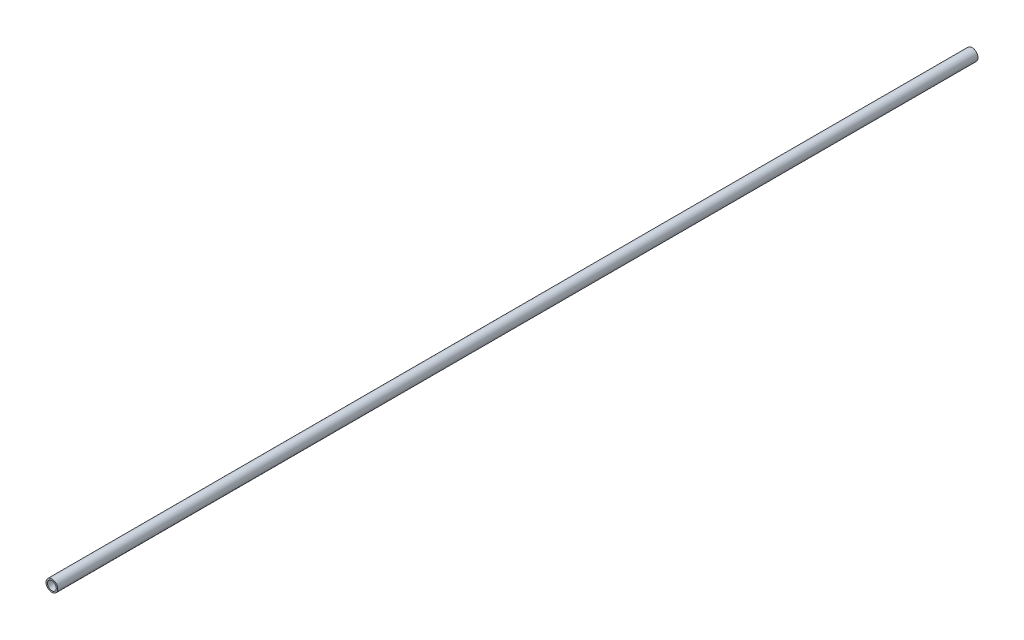
ISO-10303-21;
HEADER;
FILE_DESCRIPTION(('STEP AP214'),'2;1');
FILE_NAME('part.step','',(''),(''),'','','');
FILE_SCHEMA(('AUTOMOTIVE_DESIGN { 1 0 10303 214 1 1 1 1 }'));
ENDSEC;
DATA;
#1=APPLICATION_CONTEXT('core data for automotive mechanical design processes');
#2=APPLICATION_PROTOCOL_DEFINITION('international standard','automotive_design',2000,#1);
#3=PRODUCT_CONTEXT('',#1,'mechanical');
#4=PRODUCT('Part','Part','',(#3));
#5=PRODUCT_RELATED_PRODUCT_CATEGORY('part','',(#4));
#6=PRODUCT_DEFINITION_FORMATION('','',#4);
#7=PRODUCT_DEFINITION_CONTEXT('part definition',#1,'design');
#8=PRODUCT_DEFINITION('design','',#6,#7);
#9=PRODUCT_DEFINITION_SHAPE('','',#8);
#10=(LENGTH_UNIT() NAMED_UNIT(*) SI_UNIT(.MILLI.,.METRE.));
#11=(NAMED_UNIT(*) PLANE_ANGLE_UNIT() SI_UNIT($,.RADIAN.));
#12=(NAMED_UNIT(*) SI_UNIT($,.STERADIAN.) SOLID_ANGLE_UNIT());
#13=UNCERTAINTY_MEASURE_WITH_UNIT(LENGTH_MEASURE(1.E-05),#10,'distance_accuracy_value','');
#14=(GEOMETRIC_REPRESENTATION_CONTEXT(3) GLOBAL_UNCERTAINTY_ASSIGNED_CONTEXT((#13)) GLOBAL_UNIT_ASSIGNED_CONTEXT((#10,
#11,#12)) REPRESENTATION_CONTEXT('',''));
#15=CARTESIAN_POINT('',(0.,0.,0.));
#16=DIRECTION('',(0.,0.,1.));
#17=DIRECTION('',(1.,0.,0.));
#18=AXIS2_PLACEMENT_3D('',#15,#16,#17);
#19=CARTESIAN_POINT('',(0.,0.,6270.));
#20=DIRECTION('',(0.,0.,1.));
#21=DIRECTION('',(1.,0.,0.));
#22=AXIS2_PLACEMENT_3D('',#19,#20,#21);
#23=PLANE('',#22);
#24=CARTESIAN_POINT('',(0.,0.,6270.));
#25=DIRECTION('',(0.,0.,1.));
#26=DIRECTION('',(1.,0.,0.));
#27=AXIS2_PLACEMENT_3D('',#24,#25,#26);
#28=CIRCLE('',#27,40.);
#29=CARTESIAN_POINT('',(40.,0.,6270.));
#30=VERTEX_POINT('',#29);
#31=EDGE_CURVE('E11',#30,#30,#28,.T.);
#32=ORIENTED_EDGE('',*,*,#31,.T.);
#33=EDGE_LOOP('',(#32));
#34=FACE_BOUND('',#33,.T.);
#35=CARTESIAN_POINT('',(0.,0.,6270.));
#36=DIRECTION('',(0.,0.,1.));
#37=DIRECTION('',(1.,0.,0.));
#38=AXIS2_PLACEMENT_3D('',#35,#36,#37);
#39=CIRCLE('',#38,30.);
#40=CARTESIAN_POINT('',(30.,0.,6270.));
#41=VERTEX_POINT('',#40);
#42=EDGE_CURVE('E56',#41,#41,#39,.T.);
#43=ORIENTED_EDGE('',*,*,#42,.F.);
#44=EDGE_LOOP('',(#43));
#45=FACE_BOUND('',#44,.T.);
#46=ADVANCED_FACE('F43',(#34,#45),#23,.T.);
#47=CARTESIAN_POINT('',(0.,0.,0.));
#48=DIRECTION('',(0.,0.,1.));
#49=DIRECTION('',(1.,0.,0.));
#50=AXIS2_PLACEMENT_3D('',#47,#48,#49);
#51=PLANE('',#50);
#52=CARTESIAN_POINT('',(0.,0.,0.));
#53=DIRECTION('',(0.,0.,1.));
#54=DIRECTION('',(1.,0.,0.));
#55=AXIS2_PLACEMENT_3D('',#52,#53,#54);
#56=CIRCLE('',#55,40.);
#57=CARTESIAN_POINT('',(40.,0.,0.));
#58=VERTEX_POINT('',#57);
#59=EDGE_CURVE('E47',#58,#58,#56,.T.);
#60=ORIENTED_EDGE('',*,*,#59,.F.);
#61=EDGE_LOOP('',(#60));
#62=FACE_BOUND('',#61,.T.);
#63=CARTESIAN_POINT('',(0.,0.,0.));
#64=DIRECTION('',(0.,0.,1.));
#65=DIRECTION('',(1.,0.,0.));
#66=AXIS2_PLACEMENT_3D('',#63,#64,#65);
#67=CIRCLE('',#66,30.);
#68=CARTESIAN_POINT('',(30.,0.,0.));
#69=VERTEX_POINT('',#68);
#70=EDGE_CURVE('E58',#69,#69,#67,.T.);
#71=ORIENTED_EDGE('',*,*,#70,.T.);
#72=EDGE_LOOP('',(#71));
#73=FACE_BOUND('',#72,.T.);
#74=ADVANCED_FACE('F70',(#62,#73),#51,.F.);
#75=CARTESIAN_POINT('',(0.,0.,6270.));
#76=DIRECTION('',(0.,0.,-1.));
#77=DIRECTION('',(-1.,0.,0.));
#78=AXIS2_PLACEMENT_3D('',#75,#76,#77);
#79=CYLINDRICAL_SURFACE('',#78,40.);
#80=ORIENTED_EDGE('',*,*,#31,.F.);
#81=EDGE_LOOP('',(#80));
#82=FACE_BOUND('',#81,.T.);
#83=ORIENTED_EDGE('',*,*,#59,.T.);
#84=EDGE_LOOP('',(#83));
#85=FACE_BOUND('',#84,.T.);
#86=ADVANCED_FACE('F45',(#82,#85),#79,.T.);
#87=CARTESIAN_POINT('',(0.,0.,6270.));
#88=DIRECTION('',(0.,0.,-1.));
#89=DIRECTION('',(-1.,0.,0.));
#90=AXIS2_PLACEMENT_3D('',#87,#88,#89);
#91=CYLINDRICAL_SURFACE('',#90,30.);
#92=ORIENTED_EDGE('',*,*,#42,.T.);
#93=EDGE_LOOP('',(#92));
#94=FACE_BOUND('',#93,.T.);
#95=ORIENTED_EDGE('',*,*,#70,.F.);
#96=EDGE_LOOP('',(#95));
#97=FACE_BOUND('',#96,.T.);
#98=ADVANCED_FACE('F66',(#94,#97),#91,.F.);
#99=CLOSED_SHELL('',(#46,#74,#86,#98));
#100=MANIFOLD_SOLID_BREP('B2',#99);
#101=ADVANCED_BREP_SHAPE_REPRESENTATION('',(#18,#100),#14);
#102=SHAPE_DEFINITION_REPRESENTATION(#9,#101);
ENDSEC;
END-ISO-10303-21;
